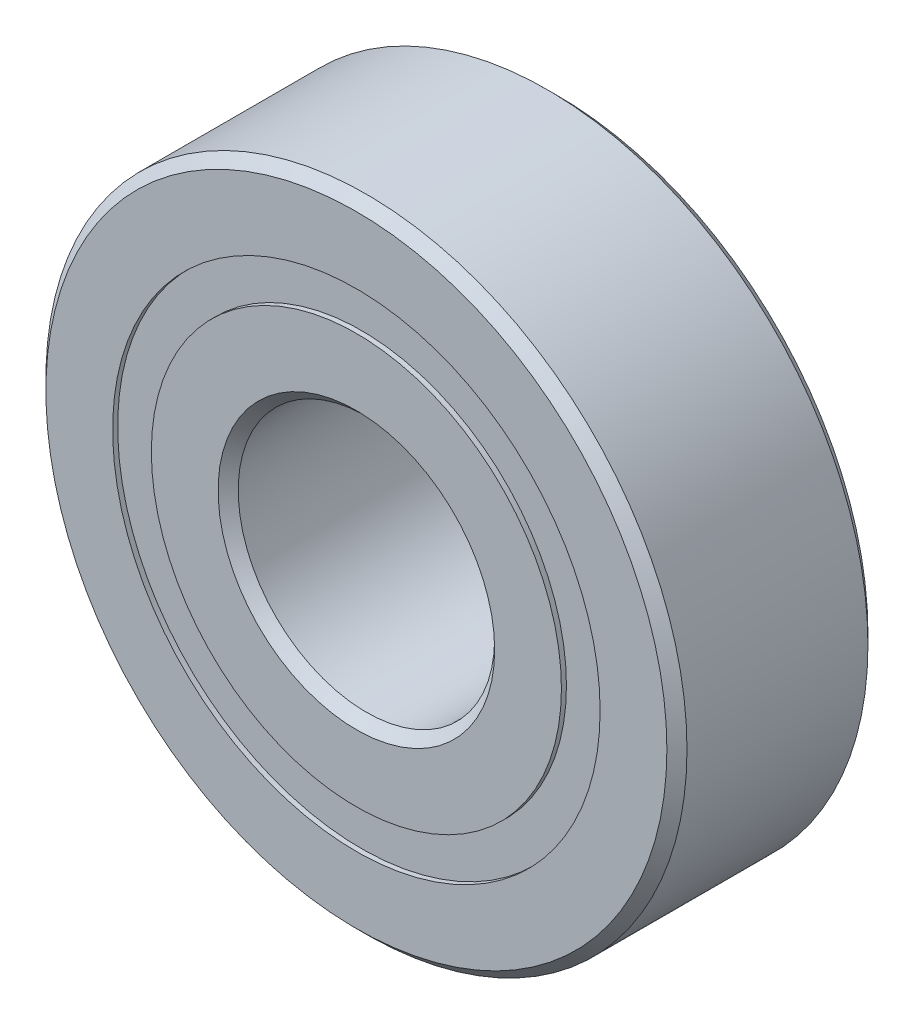
ISO-10303-21;
HEADER;
FILE_DESCRIPTION(('STEP AP214'),'2;1');
FILE_NAME('part.step','',(''),(''),'','','');
FILE_SCHEMA(('AUTOMOTIVE_DESIGN { 1 0 10303 214 1 1 1 1 }'));
ENDSEC;
DATA;
#1=APPLICATION_CONTEXT('core data for automotive mechanical design processes');
#2=APPLICATION_PROTOCOL_DEFINITION('international standard','automotive_design',2000,#1);
#3=PRODUCT_CONTEXT('',#1,'mechanical');
#4=PRODUCT('Part','Part','',(#3));
#5=PRODUCT_RELATED_PRODUCT_CATEGORY('part','',(#4));
#6=PRODUCT_DEFINITION_FORMATION('','',#4);
#7=PRODUCT_DEFINITION_CONTEXT('part definition',#1,'design');
#8=PRODUCT_DEFINITION('design','',#6,#7);
#9=PRODUCT_DEFINITION_SHAPE('','',#8);
#10=(LENGTH_UNIT() NAMED_UNIT(*) SI_UNIT(.MILLI.,.METRE.));
#11=(NAMED_UNIT(*) PLANE_ANGLE_UNIT() SI_UNIT($,.RADIAN.));
#12=(NAMED_UNIT(*) SI_UNIT($,.STERADIAN.) SOLID_ANGLE_UNIT());
#13=UNCERTAINTY_MEASURE_WITH_UNIT(LENGTH_MEASURE(1.E-05),#10,'distance_accuracy_value','');
#14=(GEOMETRIC_REPRESENTATION_CONTEXT(3) GLOBAL_UNCERTAINTY_ASSIGNED_CONTEXT((#13)) GLOBAL_UNIT_ASSIGNED_CONTEXT((#10,
#11,#12)) REPRESENTATION_CONTEXT('',''));
#15=CARTESIAN_POINT('',(0.,0.,0.));
#16=DIRECTION('',(0.,0.,1.));
#17=DIRECTION('',(1.,0.,0.));
#18=AXIS2_PLACEMENT_3D('',#15,#16,#17);
#19=CARTESIAN_POINT('',(0.,6.03522142857143,-2.36474));
#20=DIRECTION('',(0.,0.,1.));
#21=DIRECTION('',(1.,0.,0.));
#22=AXIS2_PLACEMENT_3D('',#19,#20,#21);
#23=PLANE('',#22);
#24=CARTESIAN_POINT('',(0.,0.,-2.36474));
#25=DIRECTION('',(0.,0.,1.));
#26=DIRECTION('',(1.,0.,0.));
#27=AXIS2_PLACEMENT_3D('',#24,#25,#26);
#28=CIRCLE('',#27,6.03522142857143);
#29=CARTESIAN_POINT('',(6.03522142857143,0.,-2.36474));
#30=VERTEX_POINT('',#29);
#31=EDGE_CURVE('E75',#30,#30,#28,.T.);
#32=ORIENTED_EDGE('',*,*,#31,.F.);
#33=EDGE_LOOP('',(#32));
#34=FACE_BOUND('',#33,.T.);
#35=CARTESIAN_POINT('',(0.,0.,-2.36474));
#36=DIRECTION('',(0.,0.,1.));
#37=DIRECTION('',(1.,0.,0.));
#38=AXIS2_PLACEMENT_3D('',#35,#36,#37);
#39=CIRCLE('',#38,5.07727857142857);
#40=CARTESIAN_POINT('',(5.07727857142857,0.,-2.36474));
#41=VERTEX_POINT('',#40);
#42=EDGE_CURVE('E11',#41,#41,#39,.T.);
#43=ORIENTED_EDGE('',*,*,#42,.T.);
#44=EDGE_LOOP('',(#43));
#45=FACE_BOUND('',#44,.T.);
#46=ADVANCED_FACE('F56',(#34,#45),#23,.F.);
#47=CARTESIAN_POINT('',(0.,0.,2.4892));
#48=DIRECTION('',(0.,0.,1.));
#49=DIRECTION('',(1.,0.,0.));
#50=AXIS2_PLACEMENT_3D('',#47,#48,#49);
#51=CYLINDRICAL_SURFACE('',#50,5.07727857142857);
#52=ORIENTED_EDGE('',*,*,#42,.F.);
#53=EDGE_LOOP('',(#52));
#54=FACE_BOUND('',#53,.T.);
#55=CARTESIAN_POINT('',(0.,0.,-1.20554465033679));
#56=DIRECTION('',(0.,0.,1.));
#57=DIRECTION('',(1.,0.,0.));
#58=AXIS2_PLACEMENT_3D('',#55,#56,#57);
#59=CIRCLE('',#58,5.07727857142857);
#60=CARTESIAN_POINT('',(5.07727857142857,0.,-1.20554465033679));
#61=VERTEX_POINT('',#60);
#62=EDGE_CURVE('E63',#61,#61,#59,.T.);
#63=ORIENTED_EDGE('',*,*,#62,.T.);
#64=EDGE_LOOP('',(#63));
#65=FACE_BOUND('',#64,.T.);
#66=ADVANCED_FACE('F86',(#54,#65),#51,.F.);
#67=CARTESIAN_POINT('',(0.,6.03522142857143,-1.20554465033679));
#68=DIRECTION('',(0.,0.,-1.));
#69=DIRECTION('',(-1.,0.,0.));
#70=AXIS2_PLACEMENT_3D('',#67,#68,#69);
#71=PLANE('',#70);
#72=ORIENTED_EDGE('',*,*,#62,.F.);
#73=EDGE_LOOP('',(#72));
#74=FACE_BOUND('',#73,.T.);
#75=CARTESIAN_POINT('',(0.,0.,-1.20554465033679));
#76=DIRECTION('',(0.,0.,1.));
#77=DIRECTION('',(1.,0.,0.));
#78=AXIS2_PLACEMENT_3D('',#75,#76,#77);
#79=CIRCLE('',#78,6.03522142857143);
#80=CARTESIAN_POINT('',(6.03522142857143,0.,-1.20554465033679));
#81=VERTEX_POINT('',#80);
#82=EDGE_CURVE('E69',#81,#81,#79,.T.);
#83=ORIENTED_EDGE('',*,*,#82,.T.);
#84=EDGE_LOOP('',(#83));
#85=FACE_BOUND('',#84,.T.);
#86=ADVANCED_FACE('F90',(#74,#85),#71,.F.);
#87=CARTESIAN_POINT('',(0.,0.,2.4892));
#88=DIRECTION('',(0.,0.,1.));
#89=DIRECTION('',(1.,0.,0.));
#90=AXIS2_PLACEMENT_3D('',#87,#88,#89);
#91=CYLINDRICAL_SURFACE('',#90,6.03522142857143);
#92=ORIENTED_EDGE('',*,*,#82,.F.);
#93=EDGE_LOOP('',(#92));
#94=FACE_BOUND('',#93,.T.);
#95=ORIENTED_EDGE('',*,*,#31,.T.);
#96=EDGE_LOOP('',(#95));
#97=FACE_BOUND('',#96,.T.);
#98=ADVANCED_FACE('F83',(#94,#97),#91,.T.);
#99=CLOSED_SHELL('',(#46,#66,#86,#98));
#100=MANIFOLD_SOLID_BREP('B2',#99);
#101=CARTESIAN_POINT('',(0.,6.03522142857143,2.36474));
#102=DIRECTION('',(0.,0.,-1.));
#103=DIRECTION('',(-1.,0.,0.));
#104=AXIS2_PLACEMENT_3D('',#101,#102,#103);
#105=PLANE('',#104);
#106=CARTESIAN_POINT('',(0.,0.,2.36474));
#107=DIRECTION('',(0.,0.,1.));
#108=DIRECTION('',(1.,0.,0.));
#109=AXIS2_PLACEMENT_3D('',#106,#107,#108);
#110=CIRCLE('',#109,5.07727857142857);
#111=CARTESIAN_POINT('',(5.07727857142857,0.,2.36474));
#112=VERTEX_POINT('',#111);
#113=EDGE_CURVE('E55',#112,#112,#110,.T.);
#114=ORIENTED_EDGE('',*,*,#113,.F.);
#115=EDGE_LOOP('',(#114));
#116=FACE_BOUND('',#115,.T.);
#117=CARTESIAN_POINT('',(0.,0.,2.36474));
#118=DIRECTION('',(0.,0.,1.));
#119=DIRECTION('',(1.,0.,0.));
#120=AXIS2_PLACEMENT_3D('',#117,#118,#119);
#121=CIRCLE('',#120,6.03522142857143);
#122=CARTESIAN_POINT('',(6.03522142857143,0.,2.36474));
#123=VERTEX_POINT('',#122);
#124=EDGE_CURVE('E151',#123,#123,#121,.T.);
#125=ORIENTED_EDGE('',*,*,#124,.T.);
#126=EDGE_LOOP('',(#125));
#127=FACE_BOUND('',#126,.T.);
#128=ADVANCED_FACE('F132',(#116,#127),#105,.F.);
#129=CARTESIAN_POINT('',(0.,0.,2.4892));
#130=DIRECTION('',(0.,0.,1.));
#131=DIRECTION('',(1.,0.,0.));
#132=AXIS2_PLACEMENT_3D('',#129,#130,#131);
#133=CYLINDRICAL_SURFACE('',#132,5.07727857142857);
#134=CARTESIAN_POINT('',(0.,0.,1.20554465033679));
#135=DIRECTION('',(0.,0.,1.));
#136=DIRECTION('',(1.,0.,0.));
#137=AXIS2_PLACEMENT_3D('',#134,#135,#136);
#138=CIRCLE('',#137,5.07727857142857);
#139=CARTESIAN_POINT('',(5.07727857142857,0.,1.20554465033679));
#140=VERTEX_POINT('',#139);
#141=EDGE_CURVE('E139',#140,#140,#138,.T.);
#142=ORIENTED_EDGE('',*,*,#141,.F.);
#143=EDGE_LOOP('',(#142));
#144=FACE_BOUND('',#143,.T.);
#145=ORIENTED_EDGE('',*,*,#113,.T.);
#146=EDGE_LOOP('',(#145));
#147=FACE_BOUND('',#146,.T.);
#148=ADVANCED_FACE('F168',(#144,#147),#133,.F.);
#149=CARTESIAN_POINT('',(0.,6.03522142857143,1.20554465033679));
#150=DIRECTION('',(0.,0.,1.));
#151=DIRECTION('',(1.,0.,0.));
#152=AXIS2_PLACEMENT_3D('',#149,#150,#151);
#153=PLANE('',#152);
#154=CARTESIAN_POINT('',(0.,0.,1.20554465033679));
#155=DIRECTION('',(0.,0.,1.));
#156=DIRECTION('',(1.,0.,0.));
#157=AXIS2_PLACEMENT_3D('',#154,#155,#156);
#158=CIRCLE('',#157,6.03522142857143);
#159=CARTESIAN_POINT('',(6.03522142857143,0.,1.20554465033679));
#160=VERTEX_POINT('',#159);
#161=EDGE_CURVE('E145',#160,#160,#158,.T.);
#162=ORIENTED_EDGE('',*,*,#161,.F.);
#163=EDGE_LOOP('',(#162));
#164=FACE_BOUND('',#163,.T.);
#165=ORIENTED_EDGE('',*,*,#141,.T.);
#166=EDGE_LOOP('',(#165));
#167=FACE_BOUND('',#166,.T.);
#168=ADVANCED_FACE('F163',(#164,#167),#153,.F.);
#169=CARTESIAN_POINT('',(0.,0.,2.4892));
#170=DIRECTION('',(0.,0.,1.));
#171=DIRECTION('',(1.,0.,0.));
#172=AXIS2_PLACEMENT_3D('',#169,#170,#171);
#173=CYLINDRICAL_SURFACE('',#172,6.03522142857143);
#174=ORIENTED_EDGE('',*,*,#124,.F.);
#175=EDGE_LOOP('',(#174));
#176=FACE_BOUND('',#175,.T.);
#177=ORIENTED_EDGE('',*,*,#161,.T.);
#178=EDGE_LOOP('',(#177));
#179=FACE_BOUND('',#178,.T.);
#180=ADVANCED_FACE('F160',(#176,#179),#173,.T.);
#181=CLOSED_SHELL('',(#128,#148,#168,#180));
#182=MANIFOLD_SOLID_BREP('B6',#181);
#183=CARTESIAN_POINT('',(-2.77812499999994,4.81185364977732,0.));
#184=DIRECTION('',(0.,0.,1.));
#185=DIRECTION('',(-0.499999999999989,0.866025403784445,0.));
#186=AXIS2_PLACEMENT_3D('',#183,#184,#185);
#187=SPHERICAL_SURFACE('',#186,1.20554465033679);
#188=CARTESIAN_POINT('',(-2.77812499999994,4.81185364977732,1.20554465033679));
#189=VERTEX_POINT('',#188);
#190=VERTEX_LOOP('',#189);
#191=FACE_BOUND('',#190,.T.);
#192=ADVANCED_FACE('F208',(#191),#187,.T.);
#193=CLOSED_SHELL('',(#192));
#194=MANIFOLD_SOLID_BREP('B50',#193);
#195=CARTESIAN_POINT('',(-4.81185364977726,2.77812500000006,0.));
#196=DIRECTION('',(0.,0.,1.));
#197=DIRECTION('',(-0.866025403784433,0.50000000000001,0.));
#198=AXIS2_PLACEMENT_3D('',#195,#196,#197);
#199=SPHERICAL_SURFACE('',#198,1.20554465033679);
#200=CARTESIAN_POINT('',(-4.81185364977726,2.77812500000006,1.20554465033679));
#201=VERTEX_POINT('',#200);
#202=VERTEX_LOOP('',#201);
#203=FACE_BOUND('',#202,.T.);
#204=ADVANCED_FACE('F229',(#203),#199,.T.);
#205=CLOSED_SHELL('',(#204));
#206=MANIFOLD_SOLID_BREP('B128',#205);
#207=CARTESIAN_POINT('',(-5.55625,0.,0.));
#208=DIRECTION('',(0.,0.,1.));
#209=DIRECTION('',(-1.,0.,0.));
#210=AXIS2_PLACEMENT_3D('',#207,#208,#209);
#211=SPHERICAL_SURFACE('',#210,1.20554465033679);
#212=CARTESIAN_POINT('',(-5.55625,0.,1.20554465033679));
#213=VERTEX_POINT('',#212);
#214=VERTEX_LOOP('',#213);
#215=FACE_BOUND('',#214,.T.);
#216=ADVANCED_FACE('F250',(#215),#211,.T.);
#217=CLOSED_SHELL('',(#216));
#218=MANIFOLD_SOLID_BREP('B204',#217);
#219=CARTESIAN_POINT('',(-4.81185364977731,-2.77812499999996,0.));
#220=DIRECTION('',(0.,0.,1.));
#221=DIRECTION('',(-0.866025403784443,-0.499999999999992,0.));
#222=AXIS2_PLACEMENT_3D('',#219,#220,#221);
#223=SPHERICAL_SURFACE('',#222,1.20554465033679);
#224=CARTESIAN_POINT('',(-4.81185364977731,-2.77812499999996,1.20554465033679));
#225=VERTEX_POINT('',#224);
#226=VERTEX_LOOP('',#225);
#227=FACE_BOUND('',#226,.T.);
#228=ADVANCED_FACE('F271',(#227),#223,.T.);
#229=CLOSED_SHELL('',(#228));
#230=MANIFOLD_SOLID_BREP('B225',#229);
#231=CARTESIAN_POINT('',(-2.77812500000004,-4.81185364977727,0.));
#232=DIRECTION('',(0.,0.,1.));
#233=DIRECTION('',(-0.500000000000007,-0.866025403784435,0.));
#234=AXIS2_PLACEMENT_3D('',#231,#232,#233);
#235=SPHERICAL_SURFACE('',#234,1.20554465033679);
#236=CARTESIAN_POINT('',(-2.77812500000004,-4.81185364977727,1.20554465033679));
#237=VERTEX_POINT('',#236);
#238=VERTEX_LOOP('',#237);
#239=FACE_BOUND('',#238,.T.);
#240=ADVANCED_FACE('F292',(#239),#235,.T.);
#241=CLOSED_SHELL('',(#240));
#242=MANIFOLD_SOLID_BREP('B246',#241);
#243=CARTESIAN_POINT('',(0.,-5.55625,0.));
#244=DIRECTION('',(0.,0.,1.));
#245=DIRECTION('',(0.,-1.,0.));
#246=AXIS2_PLACEMENT_3D('',#243,#244,#245);
#247=SPHERICAL_SURFACE('',#246,1.20554465033679);
#248=CARTESIAN_POINT('',(0.,-5.55625,1.20554465033679));
#249=VERTEX_POINT('',#248);
#250=VERTEX_LOOP('',#249);
#251=FACE_BOUND('',#250,.T.);
#252=ADVANCED_FACE('F313',(#251),#247,.T.);
#253=CLOSED_SHELL('',(#252));
#254=MANIFOLD_SOLID_BREP('B267',#253);
#255=CARTESIAN_POINT('',(2.77812499999997,-4.8118536497773,0.));
#256=DIRECTION('',(0.,0.,1.));
#257=DIRECTION('',(0.499999999999995,-0.866025403784442,0.));
#258=AXIS2_PLACEMENT_3D('',#255,#256,#257);
#259=SPHERICAL_SURFACE('',#258,1.20554465033679);
#260=CARTESIAN_POINT('',(2.77812499999997,-4.8118536497773,1.20554465033679));
#261=VERTEX_POINT('',#260);
#262=VERTEX_LOOP('',#261);
#263=FACE_BOUND('',#262,.T.);
#264=ADVANCED_FACE('F334',(#263),#259,.T.);
#265=CLOSED_SHELL('',(#264));
#266=MANIFOLD_SOLID_BREP('B288',#265);
#267=CARTESIAN_POINT('',(4.81185364977728,-2.77812500000002,0.));
#268=DIRECTION('',(0.,0.,1.));
#269=DIRECTION('',(0.866025403784436,-0.500000000000004,0.));
#270=AXIS2_PLACEMENT_3D('',#267,#268,#269);
#271=SPHERICAL_SURFACE('',#270,1.20554465033679);
#272=CARTESIAN_POINT('',(4.81185364977728,-2.77812500000002,1.20554465033679));
#273=VERTEX_POINT('',#272);
#274=VERTEX_LOOP('',#273);
#275=FACE_BOUND('',#274,.T.);
#276=ADVANCED_FACE('F355',(#275),#271,.T.);
#277=CLOSED_SHELL('',(#276));
#278=MANIFOLD_SOLID_BREP('B309',#277);
#279=CARTESIAN_POINT('',(5.55625,0.,0.));
#280=DIRECTION('',(0.,0.,1.));
#281=DIRECTION('',(1.,0.,0.));
#282=AXIS2_PLACEMENT_3D('',#279,#280,#281);
#283=SPHERICAL_SURFACE('',#282,1.20554465033679);
#284=CARTESIAN_POINT('',(5.55625,0.,1.20554465033679));
#285=VERTEX_POINT('',#284);
#286=VERTEX_LOOP('',#285);
#287=FACE_BOUND('',#286,.T.);
#288=ADVANCED_FACE('F376',(#287),#283,.T.);
#289=CLOSED_SHELL('',(#288));
#290=MANIFOLD_SOLID_BREP('B330',#289);
#291=CARTESIAN_POINT('',(4.81185364977729,2.77812499999999,0.));
#292=DIRECTION('',(0.,0.,1.));
#293=DIRECTION('',(0.86602540378444,0.499999999999998,0.));
#294=AXIS2_PLACEMENT_3D('',#291,#292,#293);
#295=SPHERICAL_SURFACE('',#294,1.20554465033679);
#296=CARTESIAN_POINT('',(4.81185364977729,2.77812499999999,1.20554465033679));
#297=VERTEX_POINT('',#296);
#298=VERTEX_LOOP('',#297);
#299=FACE_BOUND('',#298,.T.);
#300=ADVANCED_FACE('F397',(#299),#295,.T.);
#301=CLOSED_SHELL('',(#300));
#302=MANIFOLD_SOLID_BREP('B351',#301);
#303=CARTESIAN_POINT('',(2.77812500000001,4.81185364977728,0.));
#304=DIRECTION('',(0.,0.,1.));
#305=DIRECTION('',(0.500000000000001,0.866025403784438,0.));
#306=AXIS2_PLACEMENT_3D('',#303,#304,#305);
#307=SPHERICAL_SURFACE('',#306,1.20554465033679);
#308=CARTESIAN_POINT('',(2.77812500000001,4.81185364977728,1.20554465033679));
#309=VERTEX_POINT('',#308);
#310=VERTEX_LOOP('',#309);
#311=FACE_BOUND('',#310,.T.);
#312=ADVANCED_FACE('F418',(#311),#307,.T.);
#313=CLOSED_SHELL('',(#312));
#314=MANIFOLD_SOLID_BREP('B372',#313);
#315=CARTESIAN_POINT('',(0.,5.55625,0.));
#316=DIRECTION('',(0.,0.,1.));
#317=DIRECTION('',(0.,1.,0.));
#318=AXIS2_PLACEMENT_3D('',#315,#316,#317);
#319=SPHERICAL_SURFACE('',#318,1.20554465033679);
#320=CARTESIAN_POINT('',(0.,5.55625,1.20554465033679));
#321=VERTEX_POINT('',#320);
#322=VERTEX_LOOP('',#321);
#323=FACE_BOUND('',#322,.T.);
#324=ADVANCED_FACE('F441',(#323),#319,.T.);
#325=CLOSED_SHELL('',(#324));
#326=MANIFOLD_SOLID_BREP('B393',#325);
#327=CARTESIAN_POINT('',(0.,5.07727857142857,2.4892));
#328=DIRECTION('',(0.,0.,-1.));
#329=DIRECTION('',(-1.,0.,0.));
#330=AXIS2_PLACEMENT_3D('',#327,#328,#329);
#331=PLANE('',#330);
#332=CARTESIAN_POINT('',(0.,0.,2.4892));
#333=DIRECTION('',(0.,0.,1.));
#334=DIRECTION('',(1.,0.,0.));
#335=AXIS2_PLACEMENT_3D('',#332,#333,#334);
#336=CIRCLE('',#335,3.42392);
#337=CARTESIAN_POINT('',(3.42392,0.,2.4892));
#338=VERTEX_POINT('',#337);
#339=EDGE_CURVE('E498',#338,#338,#336,.T.);
#340=ORIENTED_EDGE('',*,*,#339,.F.);
#341=EDGE_LOOP('',(#340));
#342=FACE_BOUND('',#341,.T.);
#343=CARTESIAN_POINT('',(0.,0.,2.4892));
#344=DIRECTION('',(0.,0.,1.));
#345=DIRECTION('',(1.,0.,0.));
#346=AXIS2_PLACEMENT_3D('',#343,#344,#345);
#347=CIRCLE('',#346,5.07727857142857);
#348=CARTESIAN_POINT('',(5.07727857142857,0.,2.4892));
#349=VERTEX_POINT('',#348);
#350=EDGE_CURVE('E440',#349,#349,#347,.T.);
#351=ORIENTED_EDGE('',*,*,#350,.T.);
#352=EDGE_LOOP('',(#351));
#353=FACE_BOUND('',#352,.T.);
#354=ADVANCED_FACE('F461',(#342,#353),#331,.F.);
#355=CARTESIAN_POINT('',(0.,0.,2.4892));
#356=DIRECTION('',(0.,0.,1.));
#357=DIRECTION('',(1.,0.,0.));
#358=AXIS2_PLACEMENT_3D('',#355,#356,#357);
#359=CYLINDRICAL_SURFACE('',#358,5.07727857142857);
#360=ORIENTED_EDGE('',*,*,#350,.F.);
#361=EDGE_LOOP('',(#360));
#362=FACE_BOUND('',#361,.T.);
#363=CARTESIAN_POINT('',(0.,0.,1.10631111111111));
#364=DIRECTION('',(0.,0.,1.));
#365=DIRECTION('',(1.,0.,0.));
#366=AXIS2_PLACEMENT_3D('',#363,#364,#365);
#367=CIRCLE('',#366,5.07727857142857);
#368=CARTESIAN_POINT('',(5.07727857142857,0.,1.10631111111111));
#369=VERTEX_POINT('',#368);
#370=EDGE_CURVE('E468',#369,#369,#367,.T.);
#371=ORIENTED_EDGE('',*,*,#370,.T.);
#372=EDGE_LOOP('',(#371));
#373=FACE_BOUND('',#372,.T.);
#374=ADVANCED_FACE('F507',(#362,#373),#359,.T.);
#375=CARTESIAN_POINT('',(0.,0.,0.));
#376=DIRECTION('',(0.,0.,1.));
#377=DIRECTION('',(1.,0.,0.));
#378=AXIS2_PLACEMENT_3D('',#375,#376,#377);
#379=TOROIDAL_SURFACE('',#378,5.55625,1.20554465033679);
#380=ORIENTED_EDGE('',*,*,#370,.F.);
#381=EDGE_LOOP('',(#380));
#382=FACE_BOUND('',#381,.T.);
#383=CARTESIAN_POINT('',(0.,0.,-1.10631111111111));
#384=DIRECTION('',(0.,0.,1.));
#385=DIRECTION('',(1.,0.,0.));
#386=AXIS2_PLACEMENT_3D('',#383,#384,#385);
#387=CIRCLE('',#386,5.07727857142857);
#388=CARTESIAN_POINT('',(5.07727857142857,0.,-1.10631111111111));
#389=VERTEX_POINT('',#388);
#390=EDGE_CURVE('E474',#389,#389,#387,.T.);
#391=ORIENTED_EDGE('',*,*,#390,.T.);
#392=EDGE_LOOP('',(#391));
#393=FACE_BOUND('',#392,.T.);
#394=ADVANCED_FACE('F511',(#382,#393),#379,.F.);
#395=CARTESIAN_POINT('',(0.,0.,2.4892));
#396=DIRECTION('',(0.,0.,1.));
#397=DIRECTION('',(1.,0.,0.));
#398=AXIS2_PLACEMENT_3D('',#395,#396,#397);
#399=CYLINDRICAL_SURFACE('',#398,5.07727857142857);
#400=ORIENTED_EDGE('',*,*,#390,.F.);
#401=EDGE_LOOP('',(#400));
#402=FACE_BOUND('',#401,.T.);
#403=CARTESIAN_POINT('',(0.,0.,-2.4892));
#404=DIRECTION('',(0.,0.,1.));
#405=DIRECTION('',(1.,0.,0.));
#406=AXIS2_PLACEMENT_3D('',#403,#404,#405);
#407=CIRCLE('',#406,5.07727857142857);
#408=CARTESIAN_POINT('',(5.07727857142857,0.,-2.4892));
#409=VERTEX_POINT('',#408);
#410=EDGE_CURVE('E480',#409,#409,#407,.T.);
#411=ORIENTED_EDGE('',*,*,#410,.T.);
#412=EDGE_LOOP('',(#411));
#413=FACE_BOUND('',#412,.T.);
#414=ADVANCED_FACE('F516',(#402,#413),#399,.T.);
#415=CARTESIAN_POINT('',(0.,3.42392,-2.4892));
#416=DIRECTION('',(0.,0.,1.));
#417=DIRECTION('',(1.,0.,0.));
#418=AXIS2_PLACEMENT_3D('',#415,#416,#417);
#419=PLANE('',#418);
#420=ORIENTED_EDGE('',*,*,#410,.F.);
#421=EDGE_LOOP('',(#420));
#422=FACE_BOUND('',#421,.T.);
#423=CARTESIAN_POINT('',(0.,0.,-2.4892));
#424=DIRECTION('',(0.,0.,1.));
#425=DIRECTION('',(1.,0.,0.));
#426=AXIS2_PLACEMENT_3D('',#423,#424,#425);
#427=CIRCLE('',#426,3.42392);
#428=CARTESIAN_POINT('',(3.42392,0.,-2.4892));
#429=VERTEX_POINT('',#428);
#430=EDGE_CURVE('E486',#429,#429,#427,.T.);
#431=ORIENTED_EDGE('',*,*,#430,.T.);
#432=EDGE_LOOP('',(#431));
#433=FACE_BOUND('',#432,.T.);
#434=ADVANCED_FACE('F522',(#422,#433),#419,.F.);
#435=CARTESIAN_POINT('',(0.,0.,-2.24028));
#436=DIRECTION('',(0.,0.,-1.));
#437=DIRECTION('',(-1.,0.,0.));
#438=AXIS2_PLACEMENT_3D('',#435,#436,#437);
#439=CONICAL_SURFACE('',#438,3.175,0.785398163397448);
#440=ORIENTED_EDGE('',*,*,#430,.F.);
#441=EDGE_LOOP('',(#440));
#442=FACE_BOUND('',#441,.T.);
#443=CARTESIAN_POINT('',(0.,0.,-2.24028));
#444=DIRECTION('',(0.,0.,1.));
#445=DIRECTION('',(1.,0.,0.));
#446=AXIS2_PLACEMENT_3D('',#443,#444,#445);
#447=CIRCLE('',#446,3.175);
#448=CARTESIAN_POINT('',(3.175,0.,-2.24028));
#449=VERTEX_POINT('',#448);
#450=EDGE_CURVE('E490',#449,#449,#447,.T.);
#451=ORIENTED_EDGE('',*,*,#450,.T.);
#452=EDGE_LOOP('',(#451));
#453=FACE_BOUND('',#452,.T.);
#454=ADVANCED_FACE('F526',(#442,#453),#439,.F.);
#455=CARTESIAN_POINT('',(0.,0.,2.4892));
#456=DIRECTION('',(0.,0.,1.));
#457=DIRECTION('',(1.,0.,0.));
#458=AXIS2_PLACEMENT_3D('',#455,#456,#457);
#459=CYLINDRICAL_SURFACE('',#458,3.175);
#460=ORIENTED_EDGE('',*,*,#450,.F.);
#461=EDGE_LOOP('',(#460));
#462=FACE_BOUND('',#461,.T.);
#463=CARTESIAN_POINT('',(0.,0.,2.24028));
#464=DIRECTION('',(0.,0.,1.));
#465=DIRECTION('',(1.,0.,0.));
#466=AXIS2_PLACEMENT_3D('',#463,#464,#465);
#467=CIRCLE('',#466,3.175);
#468=CARTESIAN_POINT('',(3.175,0.,2.24028));
#469=VERTEX_POINT('',#468);
#470=EDGE_CURVE('E494',#469,#469,#467,.T.);
#471=ORIENTED_EDGE('',*,*,#470,.T.);
#472=EDGE_LOOP('',(#471));
#473=FACE_BOUND('',#472,.T.);
#474=ADVANCED_FACE('F530',(#462,#473),#459,.F.);
#475=CARTESIAN_POINT('',(0.,0.,2.4892));
#476=DIRECTION('',(0.,0.,1.));
#477=DIRECTION('',(1.,0.,0.));
#478=AXIS2_PLACEMENT_3D('',#475,#476,#477);
#479=CONICAL_SURFACE('',#478,3.42392,0.785398163397449);
#480=ORIENTED_EDGE('',*,*,#470,.F.);
#481=EDGE_LOOP('',(#480));
#482=FACE_BOUND('',#481,.T.);
#483=ORIENTED_EDGE('',*,*,#339,.T.);
#484=EDGE_LOOP('',(#483));
#485=FACE_BOUND('',#484,.T.);
#486=ADVANCED_FACE('F504',(#482,#485),#479,.F.);
#487=CLOSED_SHELL('',(#354,#374,#394,#414,#434,#454,#474,#486));
#488=MANIFOLD_SOLID_BREP('B414',#487);
#489=CARTESIAN_POINT('',(0.,0.,2.24028));
#490=DIRECTION('',(0.,0.,-1.));
#491=DIRECTION('',(-1.,0.,0.));
#492=AXIS2_PLACEMENT_3D('',#489,#490,#491);
#493=CONICAL_SURFACE('',#492,7.9375,0.785398163397447);
#494=CARTESIAN_POINT('',(0.,0.,2.4892));
#495=DIRECTION('',(0.,0.,1.));
#496=DIRECTION('',(1.,0.,0.));
#497=AXIS2_PLACEMENT_3D('',#494,#495,#496);
#498=CIRCLE('',#497,7.68858);
#499=CARTESIAN_POINT('',(7.68858,0.,2.4892));
#500=VERTEX_POINT('',#499);
#501=EDGE_CURVE('E636',#500,#500,#498,.T.);
#502=ORIENTED_EDGE('',*,*,#501,.F.);
#503=EDGE_LOOP('',(#502));
#504=FACE_BOUND('',#503,.T.);
#505=CARTESIAN_POINT('',(0.,0.,2.24028));
#506=DIRECTION('',(0.,0.,1.));
#507=DIRECTION('',(1.,0.,0.));
#508=AXIS2_PLACEMENT_3D('',#505,#506,#507);
#509=CIRCLE('',#508,7.9375);
#510=CARTESIAN_POINT('',(7.9375,0.,2.24028));
#511=VERTEX_POINT('',#510);
#512=EDGE_CURVE('E460',#511,#511,#509,.T.);
#513=ORIENTED_EDGE('',*,*,#512,.T.);
#514=EDGE_LOOP('',(#513));
#515=FACE_BOUND('',#514,.T.);
#516=ADVANCED_FACE('F599',(#504,#515),#493,.T.);
#517=CARTESIAN_POINT('',(0.,0.,2.4892));
#518=DIRECTION('',(0.,0.,1.));
#519=DIRECTION('',(1.,0.,0.));
#520=AXIS2_PLACEMENT_3D('',#517,#518,#519);
#521=CYLINDRICAL_SURFACE('',#520,7.9375);
#522=ORIENTED_EDGE('',*,*,#512,.F.);
#523=EDGE_LOOP('',(#522));
#524=FACE_BOUND('',#523,.T.);
#525=CARTESIAN_POINT('',(0.,0.,-2.24028));
#526=DIRECTION('',(0.,0.,1.));
#527=DIRECTION('',(1.,0.,0.));
#528=AXIS2_PLACEMENT_3D('',#525,#526,#527);
#529=CIRCLE('',#528,7.9375);
#530=CARTESIAN_POINT('',(7.9375,0.,-2.24028));
#531=VERTEX_POINT('',#530);
#532=EDGE_CURVE('E606',#531,#531,#529,.T.);
#533=ORIENTED_EDGE('',*,*,#532,.T.);
#534=EDGE_LOOP('',(#533));
#535=FACE_BOUND('',#534,.T.);
#536=ADVANCED_FACE('F645',(#524,#535),#521,.T.);
#537=CARTESIAN_POINT('',(0.,0.,-2.4892));
#538=DIRECTION('',(0.,0.,1.));
#539=DIRECTION('',(1.,0.,0.));
#540=AXIS2_PLACEMENT_3D('',#537,#538,#539);
#541=CONICAL_SURFACE('',#540,7.68858,0.785398163397447);
#542=ORIENTED_EDGE('',*,*,#532,.F.);
#543=EDGE_LOOP('',(#542));
#544=FACE_BOUND('',#543,.T.);
#545=CARTESIAN_POINT('',(0.,0.,-2.4892));
#546=DIRECTION('',(0.,0.,1.));
#547=DIRECTION('',(1.,0.,0.));
#548=AXIS2_PLACEMENT_3D('',#545,#546,#547);
#549=CIRCLE('',#548,7.68858);
#550=CARTESIAN_POINT('',(7.68858,0.,-2.4892));
#551=VERTEX_POINT('',#550);
#552=EDGE_CURVE('E612',#551,#551,#549,.T.);
#553=ORIENTED_EDGE('',*,*,#552,.T.);
#554=EDGE_LOOP('',(#553));
#555=FACE_BOUND('',#554,.T.);
#556=ADVANCED_FACE('F649',(#544,#555),#541,.T.);
#557=CARTESIAN_POINT('',(0.,7.68858,-2.4892));
#558=DIRECTION('',(0.,0.,1.));
#559=DIRECTION('',(1.,0.,0.));
#560=AXIS2_PLACEMENT_3D('',#557,#558,#559);
#561=PLANE('',#560);
#562=ORIENTED_EDGE('',*,*,#552,.F.);
#563=EDGE_LOOP('',(#562));
#564=FACE_BOUND('',#563,.T.);
#565=CARTESIAN_POINT('',(0.,0.,-2.4892));
#566=DIRECTION('',(0.,0.,1.));
#567=DIRECTION('',(1.,0.,0.));
#568=AXIS2_PLACEMENT_3D('',#565,#566,#567);
#569=CIRCLE('',#568,6.03522142857143);
#570=CARTESIAN_POINT('',(6.03522142857143,0.,-2.4892));
#571=VERTEX_POINT('',#570);
#572=EDGE_CURVE('E618',#571,#571,#569,.T.);
#573=ORIENTED_EDGE('',*,*,#572,.T.);
#574=EDGE_LOOP('',(#573));
#575=FACE_BOUND('',#574,.T.);
#576=ADVANCED_FACE('F654',(#564,#575),#561,.F.);
#577=CARTESIAN_POINT('',(0.,0.,2.4892));
#578=DIRECTION('',(0.,0.,1.));
#579=DIRECTION('',(1.,0.,0.));
#580=AXIS2_PLACEMENT_3D('',#577,#578,#579);
#581=CYLINDRICAL_SURFACE('',#580,6.03522142857143);
#582=ORIENTED_EDGE('',*,*,#572,.F.);
#583=EDGE_LOOP('',(#582));
#584=FACE_BOUND('',#583,.T.);
#585=CARTESIAN_POINT('',(0.,0.,-1.10631111111111));
#586=DIRECTION('',(0.,0.,1.));
#587=DIRECTION('',(1.,0.,0.));
#588=AXIS2_PLACEMENT_3D('',#585,#586,#587);
#589=CIRCLE('',#588,6.03522142857143);
#590=CARTESIAN_POINT('',(6.03522142857143,0.,-1.10631111111111));
#591=VERTEX_POINT('',#590);
#592=EDGE_CURVE('E624',#591,#591,#589,.T.);
#593=ORIENTED_EDGE('',*,*,#592,.T.);
#594=EDGE_LOOP('',(#593));
#595=FACE_BOUND('',#594,.T.);
#596=ADVANCED_FACE('F660',(#584,#595),#581,.F.);
#597=CARTESIAN_POINT('',(0.,0.,0.));
#598=DIRECTION('',(0.,0.,1.));
#599=DIRECTION('',(1.,0.,0.));
#600=AXIS2_PLACEMENT_3D('',#597,#598,#599);
#601=TOROIDAL_SURFACE('',#600,5.55625,1.20554465033679);
#602=ORIENTED_EDGE('',*,*,#592,.F.);
#603=EDGE_LOOP('',(#602));
#604=FACE_BOUND('',#603,.T.);
#605=CARTESIAN_POINT('',(0.,0.,1.10631111111111));
#606=DIRECTION('',(0.,0.,1.));
#607=DIRECTION('',(1.,0.,0.));
#608=AXIS2_PLACEMENT_3D('',#605,#606,#607);
#609=CIRCLE('',#608,6.03522142857143);
#610=CARTESIAN_POINT('',(6.03522142857143,0.,1.10631111111111));
#611=VERTEX_POINT('',#610);
#612=EDGE_CURVE('E628',#611,#611,#609,.T.);
#613=ORIENTED_EDGE('',*,*,#612,.T.);
#614=EDGE_LOOP('',(#613));
#615=FACE_BOUND('',#614,.T.);
#616=ADVANCED_FACE('F664',(#604,#615),#601,.F.);
#617=CARTESIAN_POINT('',(0.,0.,2.4892));
#618=DIRECTION('',(0.,0.,1.));
#619=DIRECTION('',(1.,0.,0.));
#620=AXIS2_PLACEMENT_3D('',#617,#618,#619);
#621=CYLINDRICAL_SURFACE('',#620,6.03522142857143);
#622=ORIENTED_EDGE('',*,*,#612,.F.);
#623=EDGE_LOOP('',(#622));
#624=FACE_BOUND('',#623,.T.);
#625=CARTESIAN_POINT('',(0.,0.,2.4892));
#626=DIRECTION('',(0.,0.,1.));
#627=DIRECTION('',(1.,0.,0.));
#628=AXIS2_PLACEMENT_3D('',#625,#626,#627);
#629=CIRCLE('',#628,6.03522142857143);
#630=CARTESIAN_POINT('',(6.03522142857143,0.,2.4892));
#631=VERTEX_POINT('',#630);
#632=EDGE_CURVE('E632',#631,#631,#629,.T.);
#633=ORIENTED_EDGE('',*,*,#632,.T.);
#634=EDGE_LOOP('',(#633));
#635=FACE_BOUND('',#634,.T.);
#636=ADVANCED_FACE('F668',(#624,#635),#621,.F.);
#637=CARTESIAN_POINT('',(0.,7.68858,2.4892));
#638=DIRECTION('',(0.,0.,-1.));
#639=DIRECTION('',(-1.,0.,0.));
#640=AXIS2_PLACEMENT_3D('',#637,#638,#639);
#641=PLANE('',#640);
#642=ORIENTED_EDGE('',*,*,#632,.F.);
#643=EDGE_LOOP('',(#642));
#644=FACE_BOUND('',#643,.T.);
#645=ORIENTED_EDGE('',*,*,#501,.T.);
#646=EDGE_LOOP('',(#645));
#647=FACE_BOUND('',#646,.T.);
#648=ADVANCED_FACE('F642',(#644,#647),#641,.F.);
#649=CLOSED_SHELL('',(#516,#536,#556,#576,#596,#616,#636,#648));
#650=MANIFOLD_SOLID_BREP('B435',#649);
#651=ADVANCED_BREP_SHAPE_REPRESENTATION('',(#18,#100,#182,#194,#206,#218,#230,#242,#254,#266,
#278,#290,#302,#314,#326,#488,#650),#14);
#652=SHAPE_DEFINITION_REPRESENTATION(#9,#651);
ENDSEC;
END-ISO-10303-21;
